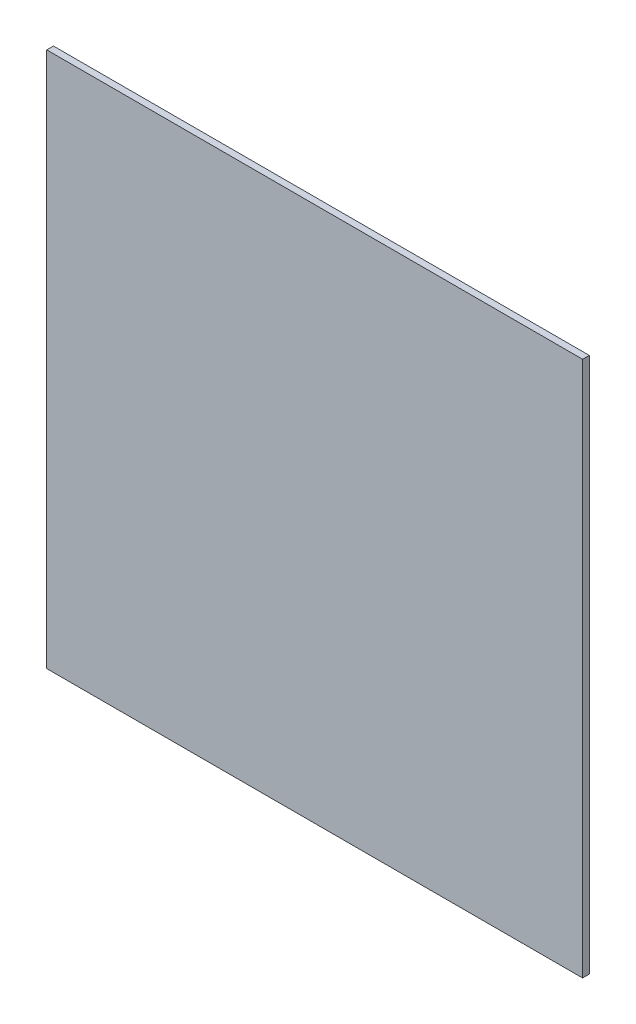
ISO-10303-21;
HEADER;
FILE_DESCRIPTION(('STEP AP214'),'2;1');
FILE_NAME('part.step','',(''),(''),'','','');
FILE_SCHEMA(('AUTOMOTIVE_DESIGN { 1 0 10303 214 1 1 1 1 }'));
ENDSEC;
DATA;
#1=APPLICATION_CONTEXT('core data for automotive mechanical design processes');
#2=APPLICATION_PROTOCOL_DEFINITION('international standard','automotive_design',2000,#1);
#3=PRODUCT_CONTEXT('',#1,'mechanical');
#4=PRODUCT('Part','Part','',(#3));
#5=PRODUCT_RELATED_PRODUCT_CATEGORY('part','',(#4));
#6=PRODUCT_DEFINITION_FORMATION('','',#4);
#7=PRODUCT_DEFINITION_CONTEXT('part definition',#1,'design');
#8=PRODUCT_DEFINITION('design','',#6,#7);
#9=PRODUCT_DEFINITION_SHAPE('','',#8);
#10=(LENGTH_UNIT() NAMED_UNIT(*) SI_UNIT(.MILLI.,.METRE.));
#11=(NAMED_UNIT(*) PLANE_ANGLE_UNIT() SI_UNIT($,.RADIAN.));
#12=(NAMED_UNIT(*) SI_UNIT($,.STERADIAN.) SOLID_ANGLE_UNIT());
#13=UNCERTAINTY_MEASURE_WITH_UNIT(LENGTH_MEASURE(1.E-05),#10,'distance_accuracy_value','');
#14=(GEOMETRIC_REPRESENTATION_CONTEXT(3) GLOBAL_UNCERTAINTY_ASSIGNED_CONTEXT((#13)) GLOBAL_UNIT_ASSIGNED_CONTEXT((#10,
#11,#12)) REPRESENTATION_CONTEXT('',''));
#15=CARTESIAN_POINT('',(0.,0.,0.));
#16=DIRECTION('',(0.,0.,1.));
#17=DIRECTION('',(1.,0.,0.));
#18=AXIS2_PLACEMENT_3D('',#15,#16,#17);
#19=CARTESIAN_POINT('',(430.911000000002,-24.5108660015524,-1.5875));
#20=DIRECTION('',(1.,0.,0.));
#21=DIRECTION('',(0.,0.,-1.));
#22=AXIS2_PLACEMENT_3D('',#19,#20,#21);
#23=PLANE('',#22);
#24=DIRECTION('',(0.,1.,0.));
#25=VECTOR('',#24,1.);
#26=CARTESIAN_POINT('',(430.911000000002,-24.5108660015524,0.));
#27=LINE('',#26,#25);
#28=CARTESIAN_POINT('',(430.911000000002,-151.510866001552,0.));
#29=VERTEX_POINT('',#28);
#30=CARTESIAN_POINT('',(430.911000000002,-24.5108660015524,0.));
#31=VERTEX_POINT('',#30);
#32=EDGE_CURVE('E97',#29,#31,#27,.T.);
#33=ORIENTED_EDGE('',*,*,#32,.F.);
#34=DIRECTION('',(0.,0.,1.));
#35=VECTOR('',#34,1.);
#36=CARTESIAN_POINT('',(430.911000000002,-151.510866001552,-1.5875));
#37=LINE('',#36,#35);
#38=CARTESIAN_POINT('',(430.911000000002,-151.510866001552,-1.5875));
#39=VERTEX_POINT('',#38);
#40=EDGE_CURVE('E11',#39,#29,#37,.T.);
#41=ORIENTED_EDGE('',*,*,#40,.F.);
#42=DIRECTION('',(0.,1.,0.));
#43=VECTOR('',#42,1.);
#44=CARTESIAN_POINT('',(430.911000000002,-24.5108660015524,-1.5875));
#45=LINE('',#44,#43);
#46=CARTESIAN_POINT('',(430.911000000002,-24.5108660015524,-1.5875));
#47=VERTEX_POINT('',#46);
#48=EDGE_CURVE('E91',#39,#47,#45,.T.);
#49=ORIENTED_EDGE('',*,*,#48,.T.);
#50=DIRECTION('',(0.,0.,1.));
#51=VECTOR('',#50,1.);
#52=CARTESIAN_POINT('',(430.911000000002,-24.5108660015524,-1.5875));
#53=LINE('',#52,#51);
#54=EDGE_CURVE('E36',#47,#31,#53,.T.);
#55=ORIENTED_EDGE('',*,*,#54,.T.);
#56=EDGE_LOOP('',(#33,#41,#49,#55));
#57=FACE_BOUND('',#56,.T.);
#58=ADVANCED_FACE('F33',(#57),#23,.T.);
#59=CARTESIAN_POINT('',(303.911000000002,-151.510866001552,-1.5875));
#60=DIRECTION('',(0.,-1.,0.));
#61=DIRECTION('',(0.,0.,-1.));
#62=AXIS2_PLACEMENT_3D('',#59,#60,#61);
#63=PLANE('',#62);
#64=DIRECTION('',(1.,0.,0.));
#65=VECTOR('',#64,1.);
#66=CARTESIAN_POINT('',(303.911000000002,-151.510866001552,0.));
#67=LINE('',#66,#65);
#68=CARTESIAN_POINT('',(303.911000000002,-151.510866001552,0.));
#69=VERTEX_POINT('',#68);
#70=EDGE_CURVE('E93',#69,#29,#67,.T.);
#71=ORIENTED_EDGE('',*,*,#70,.F.);
#72=DIRECTION('',(0.,0.,1.));
#73=VECTOR('',#72,1.);
#74=CARTESIAN_POINT('',(303.911000000002,-151.510866001552,-1.5875));
#75=LINE('',#74,#73);
#76=CARTESIAN_POINT('',(303.911000000002,-151.510866001552,-1.5875));
#77=VERTEX_POINT('',#76);
#78=EDGE_CURVE('E42',#77,#69,#75,.T.);
#79=ORIENTED_EDGE('',*,*,#78,.F.);
#80=DIRECTION('',(1.,0.,0.));
#81=VECTOR('',#80,1.);
#82=CARTESIAN_POINT('',(303.911000000002,-151.510866001552,-1.5875));
#83=LINE('',#82,#81);
#84=EDGE_CURVE('E88',#77,#39,#83,.T.);
#85=ORIENTED_EDGE('',*,*,#84,.T.);
#86=ORIENTED_EDGE('',*,*,#40,.T.);
#87=EDGE_LOOP('',(#71,#79,#85,#86));
#88=FACE_BOUND('',#87,.T.);
#89=ADVANCED_FACE('F107',(#88),#63,.T.);
#90=CARTESIAN_POINT('',(303.911000000002,-24.5108660015524,-1.5875));
#91=DIRECTION('',(-1.,0.,0.));
#92=DIRECTION('',(0.,0.,1.));
#93=AXIS2_PLACEMENT_3D('',#90,#91,#92);
#94=PLANE('',#93);
#95=DIRECTION('',(0.,-1.,0.));
#96=VECTOR('',#95,1.);
#97=CARTESIAN_POINT('',(303.911000000002,-24.5108660015524,0.));
#98=LINE('',#97,#96);
#99=CARTESIAN_POINT('',(303.911000000002,-24.5108660015524,0.));
#100=VERTEX_POINT('',#99);
#101=EDGE_CURVE('E83',#100,#69,#98,.T.);
#102=ORIENTED_EDGE('',*,*,#101,.F.);
#103=DIRECTION('',(0.,0.,1.));
#104=VECTOR('',#103,1.);
#105=CARTESIAN_POINT('',(303.911000000002,-24.5108660015524,-1.5875));
#106=LINE('',#105,#104);
#107=CARTESIAN_POINT('',(303.911000000002,-24.5108660015524,-1.5875));
#108=VERTEX_POINT('',#107);
#109=EDGE_CURVE('E78',#108,#100,#106,.T.);
#110=ORIENTED_EDGE('',*,*,#109,.F.);
#111=DIRECTION('',(0.,-1.,0.));
#112=VECTOR('',#111,1.);
#113=CARTESIAN_POINT('',(303.911000000002,-24.5108660015524,-1.5875));
#114=LINE('',#113,#112);
#115=EDGE_CURVE('E81',#108,#77,#114,.T.);
#116=ORIENTED_EDGE('',*,*,#115,.T.);
#117=ORIENTED_EDGE('',*,*,#78,.T.);
#118=EDGE_LOOP('',(#102,#110,#116,#117));
#119=FACE_BOUND('',#118,.T.);
#120=ADVANCED_FACE('F80',(#119),#94,.T.);
#121=CARTESIAN_POINT('',(303.911000000002,-24.5108660015524,-1.5875));
#122=DIRECTION('',(0.,1.,0.));
#123=DIRECTION('',(0.,0.,1.));
#124=AXIS2_PLACEMENT_3D('',#121,#122,#123);
#125=PLANE('',#124);
#126=DIRECTION('',(-1.,0.,0.));
#127=VECTOR('',#126,1.);
#128=CARTESIAN_POINT('',(303.911000000002,-24.5108660015524,0.));
#129=LINE('',#128,#127);
#130=EDGE_CURVE('E100',#31,#100,#129,.T.);
#131=ORIENTED_EDGE('',*,*,#130,.F.);
#132=ORIENTED_EDGE('',*,*,#54,.F.);
#133=DIRECTION('',(-1.,0.,0.));
#134=VECTOR('',#133,1.);
#135=CARTESIAN_POINT('',(303.911000000002,-24.5108660015524,-1.5875));
#136=LINE('',#135,#134);
#137=EDGE_CURVE('E87',#47,#108,#136,.T.);
#138=ORIENTED_EDGE('',*,*,#137,.T.);
#139=ORIENTED_EDGE('',*,*,#109,.T.);
#140=EDGE_LOOP('',(#131,#132,#138,#139));
#141=FACE_BOUND('',#140,.T.);
#142=ADVANCED_FACE('F90',(#141),#125,.T.);
#143=CARTESIAN_POINT('',(0.,0.,-1.5875));
#144=DIRECTION('',(0.,0.,1.));
#145=DIRECTION('',(1.,0.,0.));
#146=AXIS2_PLACEMENT_3D('',#143,#144,#145);
#147=PLANE('',#146);
#148=ORIENTED_EDGE('',*,*,#48,.F.);
#149=ORIENTED_EDGE('',*,*,#84,.F.);
#150=ORIENTED_EDGE('',*,*,#115,.F.);
#151=ORIENTED_EDGE('',*,*,#137,.F.);
#152=EDGE_LOOP('',(#148,#149,#150,#151));
#153=FACE_BOUND('',#152,.T.);
#154=ADVANCED_FACE('F86',(#153),#147,.F.);
#155=CARTESIAN_POINT('',(0.,0.,0.));
#156=DIRECTION('',(0.,0.,1.));
#157=DIRECTION('',(1.,0.,0.));
#158=AXIS2_PLACEMENT_3D('',#155,#156,#157);
#159=PLANE('',#158);
#160=ORIENTED_EDGE('',*,*,#32,.T.);
#161=ORIENTED_EDGE('',*,*,#130,.T.);
#162=ORIENTED_EDGE('',*,*,#101,.T.);
#163=ORIENTED_EDGE('',*,*,#70,.T.);
#164=EDGE_LOOP('',(#160,#161,#162,#163));
#165=FACE_BOUND('',#164,.T.);
#166=ADVANCED_FACE('F106',(#165),#159,.T.);
#167=CLOSED_SHELL('',(#58,#89,#120,#142,#154,#166));
#168=MANIFOLD_SOLID_BREP('B2',#167);
#169=ADVANCED_BREP_SHAPE_REPRESENTATION('',(#18,#168),#14);
#170=SHAPE_DEFINITION_REPRESENTATION(#9,#169);
ENDSEC;
END-ISO-10303-21;
